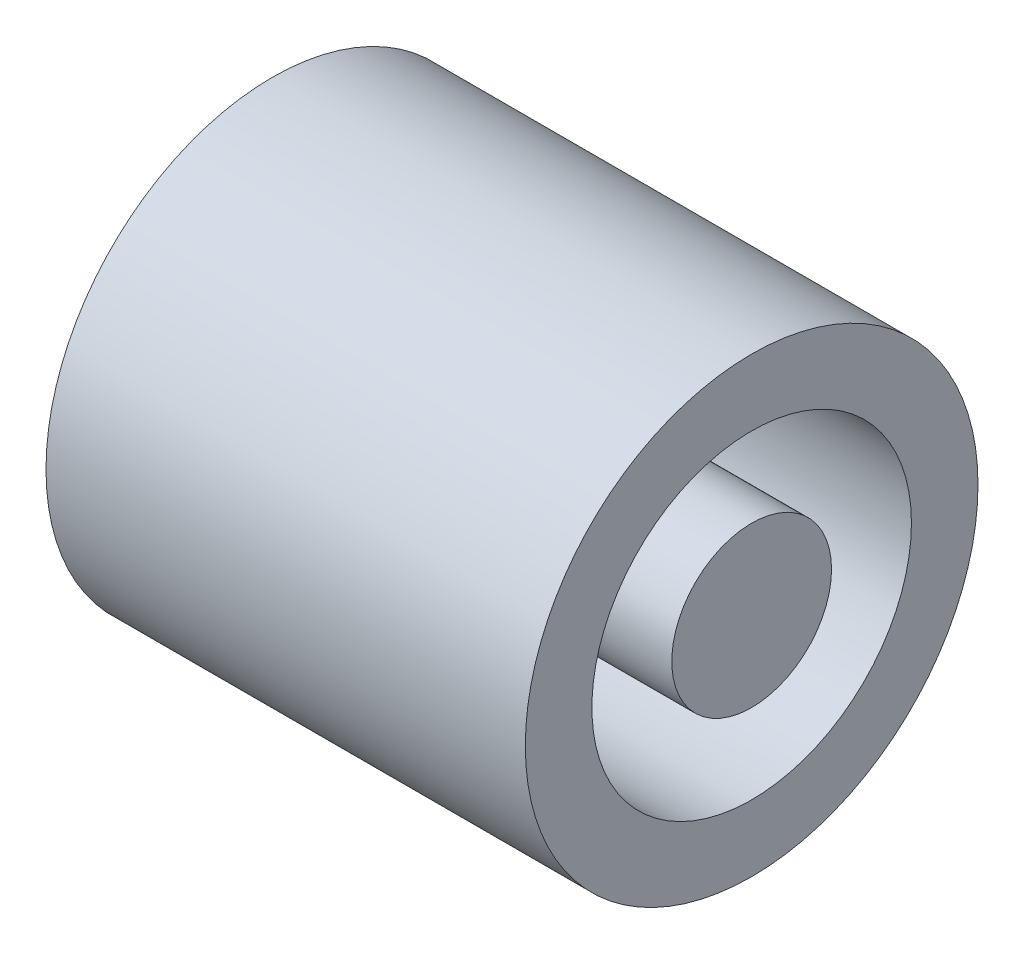
ISO-10303-21;
HEADER;
FILE_DESCRIPTION(('STEP AP214'),'2;1');
FILE_NAME('part.step','',(''),(''),'','','');
FILE_SCHEMA(('AUTOMOTIVE_DESIGN { 1 0 10303 214 1 1 1 1 }'));
ENDSEC;
DATA;
#1=APPLICATION_CONTEXT('core data for automotive mechanical design processes');
#2=APPLICATION_PROTOCOL_DEFINITION('international standard','automotive_design',2000,#1);
#3=PRODUCT_CONTEXT('',#1,'mechanical');
#4=PRODUCT('Part','Part','',(#3));
#5=PRODUCT_RELATED_PRODUCT_CATEGORY('part','',(#4));
#6=PRODUCT_DEFINITION_FORMATION('','',#4);
#7=PRODUCT_DEFINITION_CONTEXT('part definition',#1,'design');
#8=PRODUCT_DEFINITION('design','',#6,#7);
#9=PRODUCT_DEFINITION_SHAPE('','',#8);
#10=(LENGTH_UNIT() NAMED_UNIT(*) SI_UNIT(.MILLI.,.METRE.));
#11=(NAMED_UNIT(*) PLANE_ANGLE_UNIT() SI_UNIT($,.RADIAN.));
#12=(NAMED_UNIT(*) SI_UNIT($,.STERADIAN.) SOLID_ANGLE_UNIT());
#13=UNCERTAINTY_MEASURE_WITH_UNIT(LENGTH_MEASURE(1.E-05),#10,'distance_accuracy_value','');
#14=(GEOMETRIC_REPRESENTATION_CONTEXT(3) GLOBAL_UNCERTAINTY_ASSIGNED_CONTEXT((#13)) GLOBAL_UNIT_ASSIGNED_CONTEXT((#10,
#11,#12)) REPRESENTATION_CONTEXT('',''));
#15=CARTESIAN_POINT('',(0.,0.,0.));
#16=DIRECTION('',(0.,0.,1.));
#17=DIRECTION('',(1.,0.,0.));
#18=AXIS2_PLACEMENT_3D('',#15,#16,#17);
#19=CARTESIAN_POINT('',(0.,0.,0.));
#20=DIRECTION('',(1.,0.,0.));
#21=DIRECTION('',(0.,0.,-1.));
#22=AXIS2_PLACEMENT_3D('',#19,#20,#21);
#23=CYLINDRICAL_SURFACE('',#22,3.);
#24=CARTESIAN_POINT('',(0.,0.,0.));
#25=DIRECTION('',(1.,0.,0.));
#26=DIRECTION('',(0.,0.,-1.));
#27=AXIS2_PLACEMENT_3D('',#24,#25,#26);
#28=CIRCLE('',#27,3.);
#29=CARTESIAN_POINT('',(0.,0.,-3.));
#30=VERTEX_POINT('',#29);
#31=EDGE_CURVE('E11',#30,#30,#28,.T.);
#32=ORIENTED_EDGE('',*,*,#31,.T.);
#33=EDGE_LOOP('',(#32));
#34=FACE_BOUND('',#33,.T.);
#35=CARTESIAN_POINT('',(18.,0.,0.));
#36=DIRECTION('',(1.,0.,0.));
#37=DIRECTION('',(0.,0.,-1.));
#38=AXIS2_PLACEMENT_3D('',#35,#36,#37);
#39=CIRCLE('',#38,3.);
#40=CARTESIAN_POINT('',(18.,0.,-3.));
#41=VERTEX_POINT('',#40);
#42=EDGE_CURVE('E48',#41,#41,#39,.T.);
#43=ORIENTED_EDGE('',*,*,#42,.F.);
#44=EDGE_LOOP('',(#43));
#45=FACE_BOUND('',#44,.T.);
#46=ADVANCED_FACE('F45',(#34,#45),#23,.T.);
#47=CARTESIAN_POINT('',(0.,0.,0.));
#48=DIRECTION('',(1.,0.,0.));
#49=DIRECTION('',(0.,0.,-1.));
#50=AXIS2_PLACEMENT_3D('',#47,#48,#49);
#51=PLANE('',#50);
#52=ORIENTED_EDGE('',*,*,#31,.F.);
#53=EDGE_LOOP('',(#52));
#54=FACE_BOUND('',#53,.T.);
#55=ADVANCED_FACE('F60',(#54),#51,.F.);
#56=CARTESIAN_POINT('',(18.,0.,0.));
#57=DIRECTION('',(1.,0.,0.));
#58=DIRECTION('',(0.,0.,-1.));
#59=AXIS2_PLACEMENT_3D('',#56,#57,#58);
#60=PLANE('',#59);
#61=ORIENTED_EDGE('',*,*,#42,.T.);
#62=EDGE_LOOP('',(#61));
#63=FACE_BOUND('',#62,.T.);
#64=ADVANCED_FACE('F57',(#63),#60,.T.);
#65=CLOSED_SHELL('',(#46,#55,#64));
#66=MANIFOLD_SOLID_BREP('B2',#65);
#67=CARTESIAN_POINT('',(18.,0.,0.));
#68=DIRECTION('',(1.,0.,0.));
#69=DIRECTION('',(0.,0.,-1.));
#70=AXIS2_PLACEMENT_3D('',#67,#68,#69);
#71=PLANE('',#70);
#72=CARTESIAN_POINT('',(18.,0.,0.));
#73=DIRECTION('',(1.,0.,0.));
#74=DIRECTION('',(0.,0.,-1.));
#75=AXIS2_PLACEMENT_3D('',#72,#73,#74);
#76=CIRCLE('',#75,8.5);
#77=CARTESIAN_POINT('',(18.,0.,-8.5));
#78=VERTEX_POINT('',#77);
#79=EDGE_CURVE('E44',#78,#78,#76,.T.);
#80=ORIENTED_EDGE('',*,*,#79,.T.);
#81=EDGE_LOOP('',(#80));
#82=FACE_BOUND('',#81,.T.);
#83=CARTESIAN_POINT('',(18.,0.,0.));
#84=DIRECTION('',(1.,0.,0.));
#85=DIRECTION('',(0.,0.,-1.));
#86=AXIS2_PLACEMENT_3D('',#83,#84,#85);
#87=CIRCLE('',#86,6.);
#88=CARTESIAN_POINT('',(18.,0.,-6.));
#89=VERTEX_POINT('',#88);
#90=EDGE_CURVE('E99',#89,#89,#87,.T.);
#91=ORIENTED_EDGE('',*,*,#90,.F.);
#92=EDGE_LOOP('',(#91));
#93=FACE_BOUND('',#92,.T.);
#94=ADVANCED_FACE('F86',(#82,#93),#71,.T.);
#95=CARTESIAN_POINT('',(0.,0.,0.));
#96=DIRECTION('',(1.,0.,0.));
#97=DIRECTION('',(0.,0.,-1.));
#98=AXIS2_PLACEMENT_3D('',#95,#96,#97);
#99=PLANE('',#98);
#100=CARTESIAN_POINT('',(0.,0.,0.));
#101=DIRECTION('',(1.,0.,0.));
#102=DIRECTION('',(0.,0.,-1.));
#103=AXIS2_PLACEMENT_3D('',#100,#101,#102);
#104=CIRCLE('',#103,8.5);
#105=CARTESIAN_POINT('',(0.,0.,-8.5));
#106=VERTEX_POINT('',#105);
#107=EDGE_CURVE('E90',#106,#106,#104,.T.);
#108=ORIENTED_EDGE('',*,*,#107,.F.);
#109=EDGE_LOOP('',(#108));
#110=FACE_BOUND('',#109,.T.);
#111=CARTESIAN_POINT('',(0.,0.,0.));
#112=DIRECTION('',(1.,0.,0.));
#113=DIRECTION('',(0.,0.,-1.));
#114=AXIS2_PLACEMENT_3D('',#111,#112,#113);
#115=CIRCLE('',#114,6.);
#116=CARTESIAN_POINT('',(0.,0.,-6.));
#117=VERTEX_POINT('',#116);
#118=EDGE_CURVE('E101',#117,#117,#115,.T.);
#119=ORIENTED_EDGE('',*,*,#118,.T.);
#120=EDGE_LOOP('',(#119));
#121=FACE_BOUND('',#120,.T.);
#122=ADVANCED_FACE('F113',(#110,#121),#99,.F.);
#123=CARTESIAN_POINT('',(18.,0.,0.));
#124=DIRECTION('',(-1.,0.,0.));
#125=DIRECTION('',(0.,0.,1.));
#126=AXIS2_PLACEMENT_3D('',#123,#124,#125);
#127=CYLINDRICAL_SURFACE('',#126,8.5);
#128=ORIENTED_EDGE('',*,*,#79,.F.);
#129=EDGE_LOOP('',(#128));
#130=FACE_BOUND('',#129,.T.);
#131=ORIENTED_EDGE('',*,*,#107,.T.);
#132=EDGE_LOOP('',(#131));
#133=FACE_BOUND('',#132,.T.);
#134=ADVANCED_FACE('F88',(#130,#133),#127,.T.);
#135=CARTESIAN_POINT('',(18.,0.,0.));
#136=DIRECTION('',(-1.,0.,0.));
#137=DIRECTION('',(0.,0.,1.));
#138=AXIS2_PLACEMENT_3D('',#135,#136,#137);
#139=CYLINDRICAL_SURFACE('',#138,6.);
#140=ORIENTED_EDGE('',*,*,#90,.T.);
#141=EDGE_LOOP('',(#140));
#142=FACE_BOUND('',#141,.T.);
#143=ORIENTED_EDGE('',*,*,#118,.F.);
#144=EDGE_LOOP('',(#143));
#145=FACE_BOUND('',#144,.T.);
#146=ADVANCED_FACE('F109',(#142,#145),#139,.F.);
#147=CLOSED_SHELL('',(#94,#122,#134,#146));
#148=MANIFOLD_SOLID_BREP('B6',#147);
#149=ADVANCED_BREP_SHAPE_REPRESENTATION('',(#18,#66,#148),#14);
#150=SHAPE_DEFINITION_REPRESENTATION(#9,#149);
ENDSEC;
END-ISO-10303-21;
